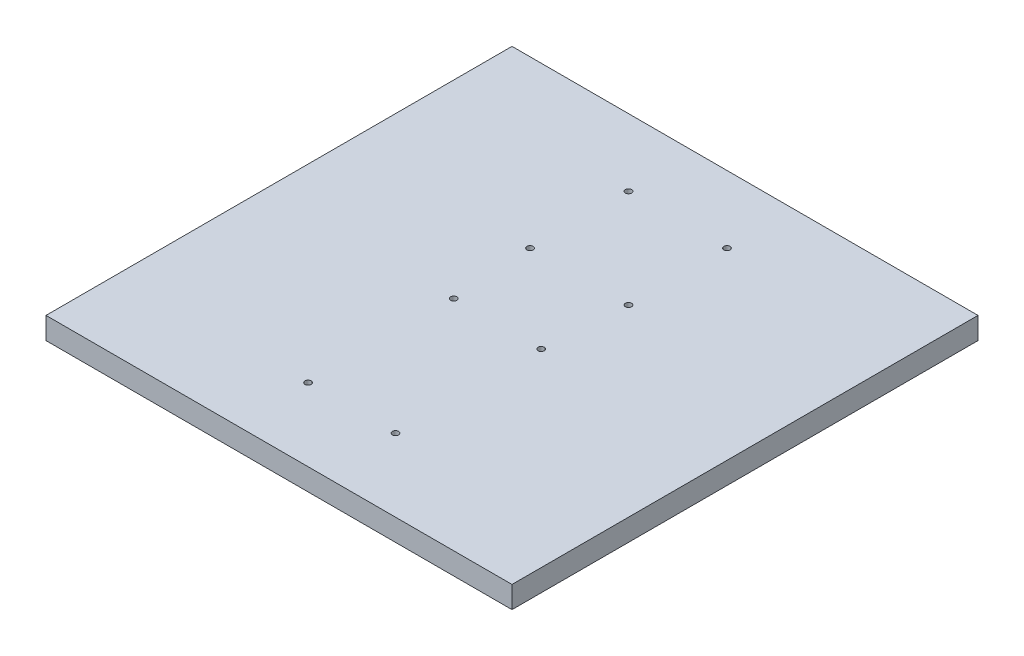
ISO-10303-21;
HEADER;
FILE_DESCRIPTION(('STEP AP214'),'2;1');
FILE_NAME('part.step','',(''),(''),'','','');
FILE_SCHEMA(('AUTOMOTIVE_DESIGN { 1 0 10303 214 1 1 1 1 }'));
ENDSEC;
DATA;
#1=APPLICATION_CONTEXT('core data for automotive mechanical design processes');
#2=APPLICATION_PROTOCOL_DEFINITION('international standard','automotive_design',2000,#1);
#3=PRODUCT_CONTEXT('',#1,'mechanical');
#4=PRODUCT('Part','Part','',(#3));
#5=PRODUCT_RELATED_PRODUCT_CATEGORY('part','',(#4));
#6=PRODUCT_DEFINITION_FORMATION('','',#4);
#7=PRODUCT_DEFINITION_CONTEXT('part definition',#1,'design');
#8=PRODUCT_DEFINITION('design','',#6,#7);
#9=PRODUCT_DEFINITION_SHAPE('','',#8);
#10=(LENGTH_UNIT() NAMED_UNIT(*) SI_UNIT(.MILLI.,.METRE.));
#11=(NAMED_UNIT(*) PLANE_ANGLE_UNIT() SI_UNIT($,.RADIAN.));
#12=(NAMED_UNIT(*) SI_UNIT($,.STERADIAN.) SOLID_ANGLE_UNIT());
#13=UNCERTAINTY_MEASURE_WITH_UNIT(LENGTH_MEASURE(1.E-05),#10,'distance_accuracy_value','');
#14=(GEOMETRIC_REPRESENTATION_CONTEXT(3) GLOBAL_UNCERTAINTY_ASSIGNED_CONTEXT((#13)) GLOBAL_UNIT_ASSIGNED_CONTEXT((#10,
#11,#12)) REPRESENTATION_CONTEXT('',''));
#15=CARTESIAN_POINT('',(0.,0.,0.));
#16=DIRECTION('',(0.,0.,1.));
#17=DIRECTION('',(1.,0.,0.));
#18=AXIS2_PLACEMENT_3D('',#15,#16,#17);
#19=CARTESIAN_POINT('',(-101.6,9.525,101.6));
#20=DIRECTION('',(1.,0.,0.));
#21=DIRECTION('',(0.,0.,-1.));
#22=AXIS2_PLACEMENT_3D('',#19,#20,#21);
#23=PLANE('',#22);
#24=DIRECTION('',(0.,0.,1.));
#25=VECTOR('',#24,1.);
#26=CARTESIAN_POINT('',(-101.6,0.,101.6));
#27=LINE('',#26,#25);
#28=CARTESIAN_POINT('',(-101.6,0.,-101.6));
#29=VERTEX_POINT('',#28);
#30=CARTESIAN_POINT('',(-101.6,0.,101.6));
#31=VERTEX_POINT('',#30);
#32=EDGE_CURVE('E95',#29,#31,#27,.T.);
#33=ORIENTED_EDGE('',*,*,#32,.T.);
#34=DIRECTION('',(0.,-1.,0.));
#35=VECTOR('',#34,1.);
#36=CARTESIAN_POINT('',(-101.6,9.525,101.6));
#37=LINE('',#36,#35);
#38=CARTESIAN_POINT('',(-101.6,9.525,101.6));
#39=VERTEX_POINT('',#38);
#40=EDGE_CURVE('E11',#39,#31,#37,.T.);
#41=ORIENTED_EDGE('',*,*,#40,.F.);
#42=DIRECTION('',(0.,0.,1.));
#43=VECTOR('',#42,1.);
#44=CARTESIAN_POINT('',(-101.6,9.525,101.6));
#45=LINE('',#44,#43);
#46=CARTESIAN_POINT('',(-101.6,9.525,-101.6));
#47=VERTEX_POINT('',#46);
#48=EDGE_CURVE('E83',#47,#39,#45,.T.);
#49=ORIENTED_EDGE('',*,*,#48,.F.);
#50=DIRECTION('',(0.,-1.,0.));
#51=VECTOR('',#50,1.);
#52=CARTESIAN_POINT('',(-101.6,9.525,-101.6));
#53=LINE('',#52,#51);
#54=EDGE_CURVE('E91',#47,#29,#53,.T.);
#55=ORIENTED_EDGE('',*,*,#54,.T.);
#56=EDGE_LOOP('',(#33,#41,#49,#55));
#57=FACE_BOUND('',#56,.T.);
#58=ADVANCED_FACE('F32',(#57),#23,.F.);
#59=CARTESIAN_POINT('',(101.6,9.525,101.6));
#60=DIRECTION('',(0.,0.,-1.));
#61=DIRECTION('',(-1.,0.,0.));
#62=AXIS2_PLACEMENT_3D('',#59,#60,#61);
#63=PLANE('',#62);
#64=DIRECTION('',(1.,0.,0.));
#65=VECTOR('',#64,1.);
#66=CARTESIAN_POINT('',(101.6,0.,101.6));
#67=LINE('',#66,#65);
#68=CARTESIAN_POINT('',(101.6,0.,101.6));
#69=VERTEX_POINT('',#68);
#70=EDGE_CURVE('E87',#31,#69,#67,.T.);
#71=ORIENTED_EDGE('',*,*,#70,.T.);
#72=DIRECTION('',(0.,-1.,0.));
#73=VECTOR('',#72,1.);
#74=CARTESIAN_POINT('',(101.6,9.525,101.6));
#75=LINE('',#74,#73);
#76=CARTESIAN_POINT('',(101.6,9.525,101.6));
#77=VERTEX_POINT('',#76);
#78=EDGE_CURVE('E40',#77,#69,#75,.T.);
#79=ORIENTED_EDGE('',*,*,#78,.F.);
#80=DIRECTION('',(1.,0.,0.));
#81=VECTOR('',#80,1.);
#82=CARTESIAN_POINT('',(101.6,9.525,101.6));
#83=LINE('',#82,#81);
#84=EDGE_CURVE('E78',#39,#77,#83,.T.);
#85=ORIENTED_EDGE('',*,*,#84,.F.);
#86=ORIENTED_EDGE('',*,*,#40,.T.);
#87=EDGE_LOOP('',(#71,#79,#85,#86));
#88=FACE_BOUND('',#87,.T.);
#89=ADVANCED_FACE('F86',(#88),#63,.F.);
#90=CARTESIAN_POINT('',(101.6,9.525,101.6));
#91=DIRECTION('',(-1.,0.,0.));
#92=DIRECTION('',(0.,0.,1.));
#93=AXIS2_PLACEMENT_3D('',#90,#91,#92);
#94=PLANE('',#93);
#95=DIRECTION('',(0.,0.,-1.));
#96=VECTOR('',#95,1.);
#97=CARTESIAN_POINT('',(101.6,0.,101.6));
#98=LINE('',#97,#96);
#99=CARTESIAN_POINT('',(101.6,0.,-101.6));
#100=VERTEX_POINT('',#99);
#101=EDGE_CURVE('E65',#69,#100,#98,.T.);
#102=ORIENTED_EDGE('',*,*,#101,.T.);
#103=DIRECTION('',(0.,-1.,0.));
#104=VECTOR('',#103,1.);
#105=CARTESIAN_POINT('',(101.6,9.525,-101.6));
#106=LINE('',#105,#104);
#107=CARTESIAN_POINT('',(101.6,9.525,-101.6));
#108=VERTEX_POINT('',#107);
#109=EDGE_CURVE('E88',#108,#100,#106,.T.);
#110=ORIENTED_EDGE('',*,*,#109,.F.);
#111=DIRECTION('',(0.,0.,-1.));
#112=VECTOR('',#111,1.);
#113=CARTESIAN_POINT('',(101.6,9.525,101.6));
#114=LINE('',#113,#112);
#115=EDGE_CURVE('E81',#77,#108,#114,.T.);
#116=ORIENTED_EDGE('',*,*,#115,.F.);
#117=ORIENTED_EDGE('',*,*,#78,.T.);
#118=EDGE_LOOP('',(#102,#110,#116,#117));
#119=FACE_BOUND('',#118,.T.);
#120=ADVANCED_FACE('F89',(#119),#94,.F.);
#121=CARTESIAN_POINT('',(101.6,9.525,-101.6));
#122=DIRECTION('',(0.,0.,1.));
#123=DIRECTION('',(1.,0.,0.));
#124=AXIS2_PLACEMENT_3D('',#121,#122,#123);
#125=PLANE('',#124);
#126=DIRECTION('',(-1.,0.,0.));
#127=VECTOR('',#126,1.);
#128=CARTESIAN_POINT('',(101.6,0.,-101.6));
#129=LINE('',#128,#127);
#130=EDGE_CURVE('E71',#100,#29,#129,.T.);
#131=ORIENTED_EDGE('',*,*,#130,.T.);
#132=ORIENTED_EDGE('',*,*,#54,.F.);
#133=DIRECTION('',(-1.,0.,0.));
#134=VECTOR('',#133,1.);
#135=CARTESIAN_POINT('',(101.6,9.525,-101.6));
#136=LINE('',#135,#134);
#137=EDGE_CURVE('E48',#108,#47,#136,.T.);
#138=ORIENTED_EDGE('',*,*,#137,.F.);
#139=ORIENTED_EDGE('',*,*,#109,.T.);
#140=EDGE_LOOP('',(#131,#132,#138,#139));
#141=FACE_BOUND('',#140,.T.);
#142=ADVANCED_FACE('F103',(#141),#125,.F.);
#143=CARTESIAN_POINT('',(0.,9.525,0.));
#144=DIRECTION('',(0.,1.,0.));
#145=DIRECTION('',(0.,0.,1.));
#146=AXIS2_PLACEMENT_3D('',#143,#144,#145);
#147=PLANE('',#146);
#148=CARTESIAN_POINT('',(-19.05,9.525,6.35));
#149=DIRECTION('',(0.,1.,0.));
#150=DIRECTION('',(0.,0.,1.));
#151=AXIS2_PLACEMENT_3D('',#148,#149,#150);
#152=CIRCLE('',#151,1.35255);
#153=CARTESIAN_POINT('',(-19.05,9.525,7.70255));
#154=VERTEX_POINT('',#153);
#155=EDGE_CURVE('E153',#154,#154,#152,.T.);
#156=ORIENTED_EDGE('',*,*,#155,.F.);
#157=EDGE_LOOP('',(#156));
#158=FACE_BOUND('',#157,.T.);
#159=CARTESIAN_POINT('',(19.05,9.525,6.35));
#160=DIRECTION('',(0.,1.,0.));
#161=DIRECTION('',(0.,0.,1.));
#162=AXIS2_PLACEMENT_3D('',#159,#160,#161);
#163=CIRCLE('',#162,1.35255);
#164=CARTESIAN_POINT('',(19.05,9.525,7.70255));
#165=VERTEX_POINT('',#164);
#166=EDGE_CURVE('E147',#165,#165,#163,.T.);
#167=ORIENTED_EDGE('',*,*,#166,.F.);
#168=EDGE_LOOP('',(#167));
#169=FACE_BOUND('',#168,.T.);
#170=CARTESIAN_POINT('',(19.05,9.525,69.85));
#171=DIRECTION('',(0.,1.,0.));
#172=DIRECTION('',(0.,0.,1.));
#173=AXIS2_PLACEMENT_3D('',#170,#171,#172);
#174=CIRCLE('',#173,1.35255);
#175=CARTESIAN_POINT('',(19.05,9.525,71.20255));
#176=VERTEX_POINT('',#175);
#177=EDGE_CURVE('E141',#176,#176,#174,.T.);
#178=ORIENTED_EDGE('',*,*,#177,.F.);
#179=EDGE_LOOP('',(#178));
#180=FACE_BOUND('',#179,.T.);
#181=CARTESIAN_POINT('',(-19.05,9.525,69.85));
#182=DIRECTION('',(0.,1.,0.));
#183=DIRECTION('',(0.,0.,1.));
#184=AXIS2_PLACEMENT_3D('',#181,#182,#183);
#185=CIRCLE('',#184,1.35255);
#186=CARTESIAN_POINT('',(-19.05,9.525,71.20255));
#187=VERTEX_POINT('',#186);
#188=EDGE_CURVE('E135',#187,#187,#185,.T.);
#189=ORIENTED_EDGE('',*,*,#188,.F.);
#190=EDGE_LOOP('',(#189));
#191=FACE_BOUND('',#190,.T.);
#192=CARTESIAN_POINT('',(-21.463,9.525,-72.263));
#193=DIRECTION('',(0.,1.,0.));
#194=DIRECTION('',(0.,0.,1.));
#195=AXIS2_PLACEMENT_3D('',#192,#193,#194);
#196=CIRCLE('',#195,1.35255);
#197=CARTESIAN_POINT('',(-21.463,9.525,-70.91045));
#198=VERTEX_POINT('',#197);
#199=EDGE_CURVE('E129',#198,#198,#196,.T.);
#200=ORIENTED_EDGE('',*,*,#199,.F.);
#201=EDGE_LOOP('',(#200));
#202=FACE_BOUND('',#201,.T.);
#203=CARTESIAN_POINT('',(21.463,9.525,-72.263));
#204=DIRECTION('',(0.,1.,0.));
#205=DIRECTION('',(0.,0.,1.));
#206=AXIS2_PLACEMENT_3D('',#203,#204,#205);
#207=CIRCLE('',#206,1.35255);
#208=CARTESIAN_POINT('',(21.463,9.525,-70.91045));
#209=VERTEX_POINT('',#208);
#210=EDGE_CURVE('E123',#209,#209,#207,.T.);
#211=ORIENTED_EDGE('',*,*,#210,.F.);
#212=EDGE_LOOP('',(#211));
#213=FACE_BOUND('',#212,.T.);
#214=CARTESIAN_POINT('',(21.463,9.525,-29.337));
#215=DIRECTION('',(0.,1.,0.));
#216=DIRECTION('',(0.,0.,1.));
#217=AXIS2_PLACEMENT_3D('',#214,#215,#216);
#218=CIRCLE('',#217,1.35255);
#219=CARTESIAN_POINT('',(21.463,9.525,-27.98445));
#220=VERTEX_POINT('',#219);
#221=EDGE_CURVE('E117',#220,#220,#218,.T.);
#222=ORIENTED_EDGE('',*,*,#221,.F.);
#223=EDGE_LOOP('',(#222));
#224=FACE_BOUND('',#223,.T.);
#225=CARTESIAN_POINT('',(-21.463,9.525,-29.337));
#226=DIRECTION('',(0.,1.,0.));
#227=DIRECTION('',(0.,0.,1.));
#228=AXIS2_PLACEMENT_3D('',#225,#226,#227);
#229=CIRCLE('',#228,1.35255);
#230=CARTESIAN_POINT('',(-21.463,9.525,-27.98445));
#231=VERTEX_POINT('',#230);
#232=EDGE_CURVE('E111',#231,#231,#229,.T.);
#233=ORIENTED_EDGE('',*,*,#232,.F.);
#234=EDGE_LOOP('',(#233));
#235=FACE_BOUND('',#234,.T.);
#236=ORIENTED_EDGE('',*,*,#48,.T.);
#237=ORIENTED_EDGE('',*,*,#84,.T.);
#238=ORIENTED_EDGE('',*,*,#115,.T.);
#239=ORIENTED_EDGE('',*,*,#137,.T.);
#240=EDGE_LOOP('',(#236,#237,#238,#239));
#241=FACE_BOUND('',#240,.T.);
#242=ADVANCED_FACE('F79',(#158,#169,#180,#191,#202,#213,#224,#235,#241),#147,.T.);
#243=CARTESIAN_POINT('',(0.,0.,0.));
#244=DIRECTION('',(0.,1.,0.));
#245=DIRECTION('',(0.,0.,1.));
#246=AXIS2_PLACEMENT_3D('',#243,#244,#245);
#247=PLANE('',#246);
#248=CARTESIAN_POINT('',(-19.05,0.,6.35));
#249=DIRECTION('',(0.,1.,0.));
#250=DIRECTION('',(0.,0.,1.));
#251=AXIS2_PLACEMENT_3D('',#248,#249,#250);
#252=CIRCLE('',#251,1.35255);
#253=CARTESIAN_POINT('',(-19.05,0.,7.70255));
#254=VERTEX_POINT('',#253);
#255=EDGE_CURVE('E150',#254,#254,#252,.T.);
#256=ORIENTED_EDGE('',*,*,#255,.T.);
#257=EDGE_LOOP('',(#256));
#258=FACE_BOUND('',#257,.T.);
#259=CARTESIAN_POINT('',(19.05,0.,6.35));
#260=DIRECTION('',(0.,1.,0.));
#261=DIRECTION('',(0.,0.,1.));
#262=AXIS2_PLACEMENT_3D('',#259,#260,#261);
#263=CIRCLE('',#262,1.35255);
#264=CARTESIAN_POINT('',(19.05,0.,7.70255));
#265=VERTEX_POINT('',#264);
#266=EDGE_CURVE('E144',#265,#265,#263,.T.);
#267=ORIENTED_EDGE('',*,*,#266,.T.);
#268=EDGE_LOOP('',(#267));
#269=FACE_BOUND('',#268,.T.);
#270=CARTESIAN_POINT('',(19.05,0.,69.85));
#271=DIRECTION('',(0.,1.,0.));
#272=DIRECTION('',(0.,0.,1.));
#273=AXIS2_PLACEMENT_3D('',#270,#271,#272);
#274=CIRCLE('',#273,1.35255);
#275=CARTESIAN_POINT('',(19.05,0.,71.20255));
#276=VERTEX_POINT('',#275);
#277=EDGE_CURVE('E138',#276,#276,#274,.T.);
#278=ORIENTED_EDGE('',*,*,#277,.T.);
#279=EDGE_LOOP('',(#278));
#280=FACE_BOUND('',#279,.T.);
#281=CARTESIAN_POINT('',(-19.05,0.,69.85));
#282=DIRECTION('',(0.,1.,0.));
#283=DIRECTION('',(0.,0.,1.));
#284=AXIS2_PLACEMENT_3D('',#281,#282,#283);
#285=CIRCLE('',#284,1.35255);
#286=CARTESIAN_POINT('',(-19.05,0.,71.20255));
#287=VERTEX_POINT('',#286);
#288=EDGE_CURVE('E132',#287,#287,#285,.T.);
#289=ORIENTED_EDGE('',*,*,#288,.T.);
#290=EDGE_LOOP('',(#289));
#291=FACE_BOUND('',#290,.T.);
#292=CARTESIAN_POINT('',(-21.463,0.,-72.263));
#293=DIRECTION('',(0.,1.,0.));
#294=DIRECTION('',(0.,0.,1.));
#295=AXIS2_PLACEMENT_3D('',#292,#293,#294);
#296=CIRCLE('',#295,1.35255);
#297=CARTESIAN_POINT('',(-21.463,0.,-70.91045));
#298=VERTEX_POINT('',#297);
#299=EDGE_CURVE('E126',#298,#298,#296,.T.);
#300=ORIENTED_EDGE('',*,*,#299,.T.);
#301=EDGE_LOOP('',(#300));
#302=FACE_BOUND('',#301,.T.);
#303=CARTESIAN_POINT('',(21.463,0.,-72.263));
#304=DIRECTION('',(0.,1.,0.));
#305=DIRECTION('',(0.,0.,1.));
#306=AXIS2_PLACEMENT_3D('',#303,#304,#305);
#307=CIRCLE('',#306,1.35255);
#308=CARTESIAN_POINT('',(21.463,0.,-70.91045));
#309=VERTEX_POINT('',#308);
#310=EDGE_CURVE('E120',#309,#309,#307,.T.);
#311=ORIENTED_EDGE('',*,*,#310,.T.);
#312=EDGE_LOOP('',(#311));
#313=FACE_BOUND('',#312,.T.);
#314=CARTESIAN_POINT('',(21.463,0.,-29.337));
#315=DIRECTION('',(0.,1.,0.));
#316=DIRECTION('',(0.,0.,1.));
#317=AXIS2_PLACEMENT_3D('',#314,#315,#316);
#318=CIRCLE('',#317,1.35255);
#319=CARTESIAN_POINT('',(21.463,0.,-27.98445));
#320=VERTEX_POINT('',#319);
#321=EDGE_CURVE('E114',#320,#320,#318,.T.);
#322=ORIENTED_EDGE('',*,*,#321,.T.);
#323=EDGE_LOOP('',(#322));
#324=FACE_BOUND('',#323,.T.);
#325=CARTESIAN_POINT('',(-21.463,0.,-29.337));
#326=DIRECTION('',(0.,1.,0.));
#327=DIRECTION('',(0.,0.,1.));
#328=AXIS2_PLACEMENT_3D('',#325,#326,#327);
#329=CIRCLE('',#328,1.35255);
#330=CARTESIAN_POINT('',(-21.463,0.,-27.98445));
#331=VERTEX_POINT('',#330);
#332=EDGE_CURVE('E98',#331,#331,#329,.T.);
#333=ORIENTED_EDGE('',*,*,#332,.T.);
#334=EDGE_LOOP('',(#333));
#335=FACE_BOUND('',#334,.T.);
#336=ORIENTED_EDGE('',*,*,#32,.F.);
#337=ORIENTED_EDGE('',*,*,#130,.F.);
#338=ORIENTED_EDGE('',*,*,#101,.F.);
#339=ORIENTED_EDGE('',*,*,#70,.F.);
#340=EDGE_LOOP('',(#336,#337,#338,#339));
#341=FACE_BOUND('',#340,.T.);
#342=ADVANCED_FACE('F106',(#258,#269,#280,#291,#302,#313,#324,#335,#341),#247,.F.);
#343=CARTESIAN_POINT('',(-21.463,9.525,-29.337));
#344=DIRECTION('',(0.,1.,0.));
#345=DIRECTION('',(0.,0.,1.));
#346=AXIS2_PLACEMENT_3D('',#343,#344,#345);
#347=CYLINDRICAL_SURFACE('',#346,1.35255);
#348=ORIENTED_EDGE('',*,*,#332,.F.);
#349=EDGE_LOOP('',(#348));
#350=FACE_BOUND('',#349,.T.);
#351=ORIENTED_EDGE('',*,*,#232,.T.);
#352=EDGE_LOOP('',(#351));
#353=FACE_BOUND('',#352,.T.);
#354=ADVANCED_FACE('F176',(#350,#353),#347,.F.);
#355=CARTESIAN_POINT('',(21.463,9.525,-29.337));
#356=DIRECTION('',(0.,1.,0.));
#357=DIRECTION('',(0.,0.,1.));
#358=AXIS2_PLACEMENT_3D('',#355,#356,#357);
#359=CYLINDRICAL_SURFACE('',#358,1.35255);
#360=ORIENTED_EDGE('',*,*,#321,.F.);
#361=EDGE_LOOP('',(#360));
#362=FACE_BOUND('',#361,.T.);
#363=ORIENTED_EDGE('',*,*,#221,.T.);
#364=EDGE_LOOP('',(#363));
#365=FACE_BOUND('',#364,.T.);
#366=ADVANCED_FACE('F178',(#362,#365),#359,.F.);
#367=CARTESIAN_POINT('',(21.463,9.525,-72.263));
#368=DIRECTION('',(0.,1.,0.));
#369=DIRECTION('',(0.,0.,1.));
#370=AXIS2_PLACEMENT_3D('',#367,#368,#369);
#371=CYLINDRICAL_SURFACE('',#370,1.35255);
#372=ORIENTED_EDGE('',*,*,#310,.F.);
#373=EDGE_LOOP('',(#372));
#374=FACE_BOUND('',#373,.T.);
#375=ORIENTED_EDGE('',*,*,#210,.T.);
#376=EDGE_LOOP('',(#375));
#377=FACE_BOUND('',#376,.T.);
#378=ADVANCED_FACE('F185',(#374,#377),#371,.F.);
#379=CARTESIAN_POINT('',(-21.463,9.525,-72.263));
#380=DIRECTION('',(0.,1.,0.));
#381=DIRECTION('',(0.,0.,1.));
#382=AXIS2_PLACEMENT_3D('',#379,#380,#381);
#383=CYLINDRICAL_SURFACE('',#382,1.35255);
#384=ORIENTED_EDGE('',*,*,#299,.F.);
#385=EDGE_LOOP('',(#384));
#386=FACE_BOUND('',#385,.T.);
#387=ORIENTED_EDGE('',*,*,#199,.T.);
#388=EDGE_LOOP('',(#387));
#389=FACE_BOUND('',#388,.T.);
#390=ADVANCED_FACE('F226',(#386,#389),#383,.F.);
#391=CARTESIAN_POINT('',(-19.05,9.525,69.85));
#392=DIRECTION('',(0.,1.,0.));
#393=DIRECTION('',(0.,0.,1.));
#394=AXIS2_PLACEMENT_3D('',#391,#392,#393);
#395=CYLINDRICAL_SURFACE('',#394,1.35255);
#396=ORIENTED_EDGE('',*,*,#288,.F.);
#397=EDGE_LOOP('',(#396));
#398=FACE_BOUND('',#397,.T.);
#399=ORIENTED_EDGE('',*,*,#188,.T.);
#400=EDGE_LOOP('',(#399));
#401=FACE_BOUND('',#400,.T.);
#402=ADVANCED_FACE('F220',(#398,#401),#395,.F.);
#403=CARTESIAN_POINT('',(19.05,9.525,69.85));
#404=DIRECTION('',(0.,1.,0.));
#405=DIRECTION('',(0.,0.,1.));
#406=AXIS2_PLACEMENT_3D('',#403,#404,#405);
#407=CYLINDRICAL_SURFACE('',#406,1.35255);
#408=ORIENTED_EDGE('',*,*,#277,.F.);
#409=EDGE_LOOP('',(#408));
#410=FACE_BOUND('',#409,.T.);
#411=ORIENTED_EDGE('',*,*,#177,.T.);
#412=EDGE_LOOP('',(#411));
#413=FACE_BOUND('',#412,.T.);
#414=ADVANCED_FACE('F225',(#410,#413),#407,.F.);
#415=CARTESIAN_POINT('',(19.05,9.525,6.35));
#416=DIRECTION('',(0.,1.,0.));
#417=DIRECTION('',(0.,0.,1.));
#418=AXIS2_PLACEMENT_3D('',#415,#416,#417);
#419=CYLINDRICAL_SURFACE('',#418,1.35255);
#420=ORIENTED_EDGE('',*,*,#266,.F.);
#421=EDGE_LOOP('',(#420));
#422=FACE_BOUND('',#421,.T.);
#423=ORIENTED_EDGE('',*,*,#166,.T.);
#424=EDGE_LOOP('',(#423));
#425=FACE_BOUND('',#424,.T.);
#426=ADVANCED_FACE('F238',(#422,#425),#419,.F.);
#427=CARTESIAN_POINT('',(-19.05,9.525,6.35));
#428=DIRECTION('',(0.,1.,0.));
#429=DIRECTION('',(0.,0.,1.));
#430=AXIS2_PLACEMENT_3D('',#427,#428,#429);
#431=CYLINDRICAL_SURFACE('',#430,1.35255);
#432=ORIENTED_EDGE('',*,*,#255,.F.);
#433=EDGE_LOOP('',(#432));
#434=FACE_BOUND('',#433,.T.);
#435=ORIENTED_EDGE('',*,*,#155,.T.);
#436=EDGE_LOOP('',(#435));
#437=FACE_BOUND('',#436,.T.);
#438=ADVANCED_FACE('F157',(#434,#437),#431,.F.);
#439=CLOSED_SHELL('',(#58,#89,#120,#142,#242,#342,#354,#366,#378,#390,#402,#414,#426,#438));
#440=MANIFOLD_SOLID_BREP('B2',#439);
#441=ADVANCED_BREP_SHAPE_REPRESENTATION('',(#18,#440),#14);
#442=SHAPE_DEFINITION_REPRESENTATION(#9,#441);
ENDSEC;
END-ISO-10303-21;
